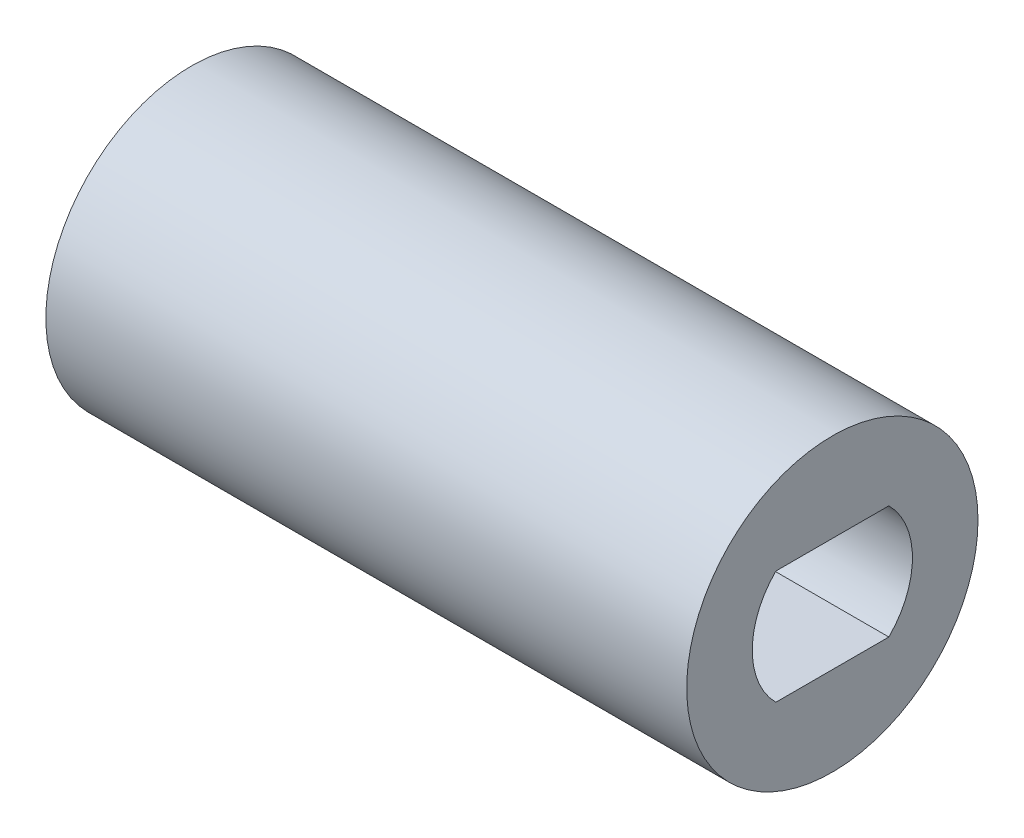
ISO-10303-21;
HEADER;
FILE_DESCRIPTION(('STEP AP214'),'2;1');
FILE_NAME('part.step','',(''),(''),'','','');
FILE_SCHEMA(('AUTOMOTIVE_DESIGN { 1 0 10303 214 1 1 1 1 }'));
ENDSEC;
DATA;
#1=APPLICATION_CONTEXT('core data for automotive mechanical design processes');
#2=APPLICATION_PROTOCOL_DEFINITION('international standard','automotive_design',2000,#1);
#3=PRODUCT_CONTEXT('',#1,'mechanical');
#4=PRODUCT('Part','Part','',(#3));
#5=PRODUCT_RELATED_PRODUCT_CATEGORY('part','',(#4));
#6=PRODUCT_DEFINITION_FORMATION('','',#4);
#7=PRODUCT_DEFINITION_CONTEXT('part definition',#1,'design');
#8=PRODUCT_DEFINITION('design','',#6,#7);
#9=PRODUCT_DEFINITION_SHAPE('','',#8);
#10=(LENGTH_UNIT() NAMED_UNIT(*) SI_UNIT(.MILLI.,.METRE.));
#11=(NAMED_UNIT(*) PLANE_ANGLE_UNIT() SI_UNIT($,.RADIAN.));
#12=(NAMED_UNIT(*) SI_UNIT($,.STERADIAN.) SOLID_ANGLE_UNIT());
#13=UNCERTAINTY_MEASURE_WITH_UNIT(LENGTH_MEASURE(1.E-05),#10,'distance_accuracy_value','');
#14=(GEOMETRIC_REPRESENTATION_CONTEXT(3) GLOBAL_UNCERTAINTY_ASSIGNED_CONTEXT((#13)) GLOBAL_UNIT_ASSIGNED_CONTEXT((#10,
#11,#12)) REPRESENTATION_CONTEXT('',''));
#15=CARTESIAN_POINT('',(0.,0.,0.));
#16=DIRECTION('',(0.,0.,1.));
#17=DIRECTION('',(1.,0.,0.));
#18=AXIS2_PLACEMENT_3D('',#15,#16,#17);
#19=CARTESIAN_POINT('',(14.,0.,0.));
#20=DIRECTION('',(1.,0.,0.));
#21=DIRECTION('',(0.,0.,-1.));
#22=AXIS2_PLACEMENT_3D('',#19,#20,#21);
#23=PLANE('',#22);
#24=DIRECTION('',(0.,0.,-1.));
#25=VECTOR('',#24,1.);
#26=CARTESIAN_POINT('',(14.,1.95,0.));
#27=LINE('',#26,#25);
#28=CARTESIAN_POINT('',(14.,1.95,1.93907194296654));
#29=VERTEX_POINT('',#28);
#30=CARTESIAN_POINT('',(14.,1.95,-1.93907194296654));
#31=VERTEX_POINT('',#30);
#32=EDGE_CURVE('E64',#29,#31,#27,.T.);
#33=ORIENTED_EDGE('',*,*,#32,.F.);
#34=CARTESIAN_POINT('',(14.,0.,0.));
#35=DIRECTION('',(1.,0.,0.));
#36=DIRECTION('',(0.,0.,-1.));
#37=AXIS2_PLACEMENT_3D('',#34,#35,#36);
#38=CIRCLE('',#37,2.75);
#39=CARTESIAN_POINT('',(14.,-1.95,1.93907194296654));
#40=VERTEX_POINT('',#39);
#41=EDGE_CURVE('E97',#29,#40,#38,.T.);
#42=ORIENTED_EDGE('',*,*,#41,.T.);
#43=DIRECTION('',(0.,0.,1.));
#44=VECTOR('',#43,1.);
#45=CARTESIAN_POINT('',(14.,-1.95,0.));
#46=LINE('',#45,#44);
#47=CARTESIAN_POINT('',(14.,-1.95,-1.93907194296654));
#48=VERTEX_POINT('',#47);
#49=EDGE_CURVE('E84',#48,#40,#46,.T.);
#50=ORIENTED_EDGE('',*,*,#49,.F.);
#51=EDGE_CURVE('E96',#48,#31,#38,.T.);
#52=ORIENTED_EDGE('',*,*,#51,.T.);
#53=EDGE_LOOP('',(#33,#42,#50,#52));
#54=FACE_BOUND('',#53,.T.);
#55=ADVANCED_FACE('F42',(#54),#23,.T.);
#56=CARTESIAN_POINT('',(14.,-1.95,0.));
#57=DIRECTION('',(0.,1.,0.));
#58=DIRECTION('',(0.,0.,1.));
#59=AXIS2_PLACEMENT_3D('',#56,#57,#58);
#60=PLANE('',#59);
#61=DIRECTION('',(0.,0.,1.));
#62=VECTOR('',#61,1.);
#63=CARTESIAN_POINT('',(22.,-1.95,0.));
#64=LINE('',#63,#62);
#65=CARTESIAN_POINT('',(22.,-1.95,-1.93907194296654));
#66=VERTEX_POINT('',#65);
#67=CARTESIAN_POINT('',(22.,-1.95,1.93907194296654));
#68=VERTEX_POINT('',#67);
#69=EDGE_CURVE('E119',#66,#68,#64,.T.);
#70=ORIENTED_EDGE('',*,*,#69,.F.);
#71=DIRECTION('',(1.,0.,0.));
#72=VECTOR('',#71,1.);
#73=CARTESIAN_POINT('',(14.,-1.95,-1.93907194296654));
#74=LINE('',#73,#72);
#75=EDGE_CURVE('E90',#48,#66,#74,.T.);
#76=ORIENTED_EDGE('',*,*,#75,.F.);
#77=ORIENTED_EDGE('',*,*,#49,.T.);
#78=DIRECTION('',(1.,0.,0.));
#79=VECTOR('',#78,1.);
#80=CARTESIAN_POINT('',(14.,-1.95,1.93907194296654));
#81=LINE('',#80,#79);
#82=EDGE_CURVE('E88',#40,#68,#81,.T.);
#83=ORIENTED_EDGE('',*,*,#82,.T.);
#84=EDGE_LOOP('',(#70,#76,#77,#83));
#85=FACE_BOUND('',#84,.T.);
#86=ADVANCED_FACE('F87',(#85),#60,.T.);
#87=CARTESIAN_POINT('',(14.,0.,0.));
#88=DIRECTION('',(1.,0.,0.));
#89=DIRECTION('',(0.,0.,-1.));
#90=AXIS2_PLACEMENT_3D('',#87,#88,#89);
#91=CYLINDRICAL_SURFACE('',#90,2.75);
#92=CARTESIAN_POINT('',(22.,0.,0.));
#93=DIRECTION('',(1.,0.,0.));
#94=DIRECTION('',(0.,0.,-1.));
#95=AXIS2_PLACEMENT_3D('',#92,#93,#94);
#96=CIRCLE('',#95,2.75);
#97=CARTESIAN_POINT('',(22.,1.95,-1.93907194296654));
#98=VERTEX_POINT('',#97);
#99=EDGE_CURVE('E110',#66,#98,#96,.T.);
#100=ORIENTED_EDGE('',*,*,#99,.T.);
#101=DIRECTION('',(1.,0.,0.));
#102=VECTOR('',#101,1.);
#103=CARTESIAN_POINT('',(14.,1.95,-1.93907194296654));
#104=LINE('',#103,#102);
#105=EDGE_CURVE('E51',#31,#98,#104,.T.);
#106=ORIENTED_EDGE('',*,*,#105,.F.);
#107=ORIENTED_EDGE('',*,*,#51,.F.);
#108=ORIENTED_EDGE('',*,*,#75,.T.);
#109=EDGE_LOOP('',(#100,#106,#107,#108));
#110=FACE_BOUND('',#109,.T.);
#111=ADVANCED_FACE('F149',(#110),#91,.F.);
#112=CARTESIAN_POINT('',(14.,1.95,0.));
#113=DIRECTION('',(0.,-1.,0.));
#114=DIRECTION('',(0.,0.,-1.));
#115=AXIS2_PLACEMENT_3D('',#112,#113,#114);
#116=PLANE('',#115);
#117=DIRECTION('',(0.,0.,-1.));
#118=VECTOR('',#117,1.);
#119=CARTESIAN_POINT('',(22.,1.95,0.));
#120=LINE('',#119,#118);
#121=CARTESIAN_POINT('',(22.,1.95,1.93907194296654));
#122=VERTEX_POINT('',#121);
#123=EDGE_CURVE('E58',#122,#98,#120,.T.);
#124=ORIENTED_EDGE('',*,*,#123,.F.);
#125=DIRECTION('',(1.,0.,0.));
#126=VECTOR('',#125,1.);
#127=CARTESIAN_POINT('',(14.,1.95,1.93907194296654));
#128=LINE('',#127,#126);
#129=EDGE_CURVE('E80',#29,#122,#128,.T.);
#130=ORIENTED_EDGE('',*,*,#129,.F.);
#131=ORIENTED_EDGE('',*,*,#32,.T.);
#132=ORIENTED_EDGE('',*,*,#105,.T.);
#133=EDGE_LOOP('',(#124,#130,#131,#132));
#134=FACE_BOUND('',#133,.T.);
#135=ADVANCED_FACE('F153',(#134),#116,.T.);
#136=EDGE_CURVE('E103',#122,#68,#96,.T.);
#137=ORIENTED_EDGE('',*,*,#136,.T.);
#138=ORIENTED_EDGE('',*,*,#82,.F.);
#139=ORIENTED_EDGE('',*,*,#41,.F.);
#140=ORIENTED_EDGE('',*,*,#129,.T.);
#141=EDGE_LOOP('',(#137,#138,#139,#140));
#142=FACE_BOUND('',#141,.T.);
#143=ADVANCED_FACE('F101',(#142),#91,.F.);
#144=CARTESIAN_POINT('',(22.,0.,0.));
#145=DIRECTION('',(1.,0.,0.));
#146=DIRECTION('',(0.,0.,-1.));
#147=AXIS2_PLACEMENT_3D('',#144,#145,#146);
#148=PLANE('',#147);
#149=CARTESIAN_POINT('',(22.,0.,0.));
#150=DIRECTION('',(1.,0.,0.));
#151=DIRECTION('',(0.,0.,-1.));
#152=AXIS2_PLACEMENT_3D('',#149,#150,#151);
#153=CIRCLE('',#152,5.);
#154=CARTESIAN_POINT('',(22.,0.,-5.));
#155=VERTEX_POINT('',#154);
#156=EDGE_CURVE('E11',#155,#155,#153,.T.);
#157=ORIENTED_EDGE('',*,*,#156,.T.);
#158=EDGE_LOOP('',(#157));
#159=FACE_BOUND('',#158,.T.);
#160=ORIENTED_EDGE('',*,*,#136,.F.);
#161=ORIENTED_EDGE('',*,*,#123,.T.);
#162=ORIENTED_EDGE('',*,*,#99,.F.);
#163=ORIENTED_EDGE('',*,*,#69,.T.);
#164=EDGE_LOOP('',(#160,#161,#162,#163));
#165=FACE_BOUND('',#164,.T.);
#166=ADVANCED_FACE('F140',(#159,#165),#148,.T.);
#167=CARTESIAN_POINT('',(22.,0.,0.));
#168=DIRECTION('',(-1.,0.,0.));
#169=DIRECTION('',(0.,0.,1.));
#170=AXIS2_PLACEMENT_3D('',#167,#168,#169);
#171=CYLINDRICAL_SURFACE('',#170,5.);
#172=ORIENTED_EDGE('',*,*,#156,.F.);
#173=EDGE_LOOP('',(#172));
#174=FACE_BOUND('',#173,.T.);
#175=CARTESIAN_POINT('',(0.,0.,0.));
#176=DIRECTION('',(1.,0.,0.));
#177=DIRECTION('',(0.,0.,-1.));
#178=AXIS2_PLACEMENT_3D('',#175,#176,#177);
#179=CIRCLE('',#178,5.);
#180=CARTESIAN_POINT('',(0.,0.,-5.));
#181=VERTEX_POINT('',#180);
#182=EDGE_CURVE('E125',#181,#181,#179,.T.);
#183=ORIENTED_EDGE('',*,*,#182,.T.);
#184=EDGE_LOOP('',(#183));
#185=FACE_BOUND('',#184,.T.);
#186=ADVANCED_FACE('F133',(#174,#185),#171,.T.);
#187=CARTESIAN_POINT('',(0.,0.,0.));
#188=DIRECTION('',(1.,0.,0.));
#189=DIRECTION('',(0.,0.,-1.));
#190=AXIS2_PLACEMENT_3D('',#187,#188,#189);
#191=PLANE('',#190);
#192=ORIENTED_EDGE('',*,*,#182,.F.);
#193=EDGE_LOOP('',(#192));
#194=FACE_BOUND('',#193,.T.);
#195=ADVANCED_FACE('F44',(#194),#191,.F.);
#196=CLOSED_SHELL('',(#55,#86,#111,#135,#143,#166,#186,#195));
#197=MANIFOLD_SOLID_BREP('B2',#196);
#198=ADVANCED_BREP_SHAPE_REPRESENTATION('',(#18,#197),#14);
#199=SHAPE_DEFINITION_REPRESENTATION(#9,#198);
ENDSEC;
END-ISO-10303-21;
